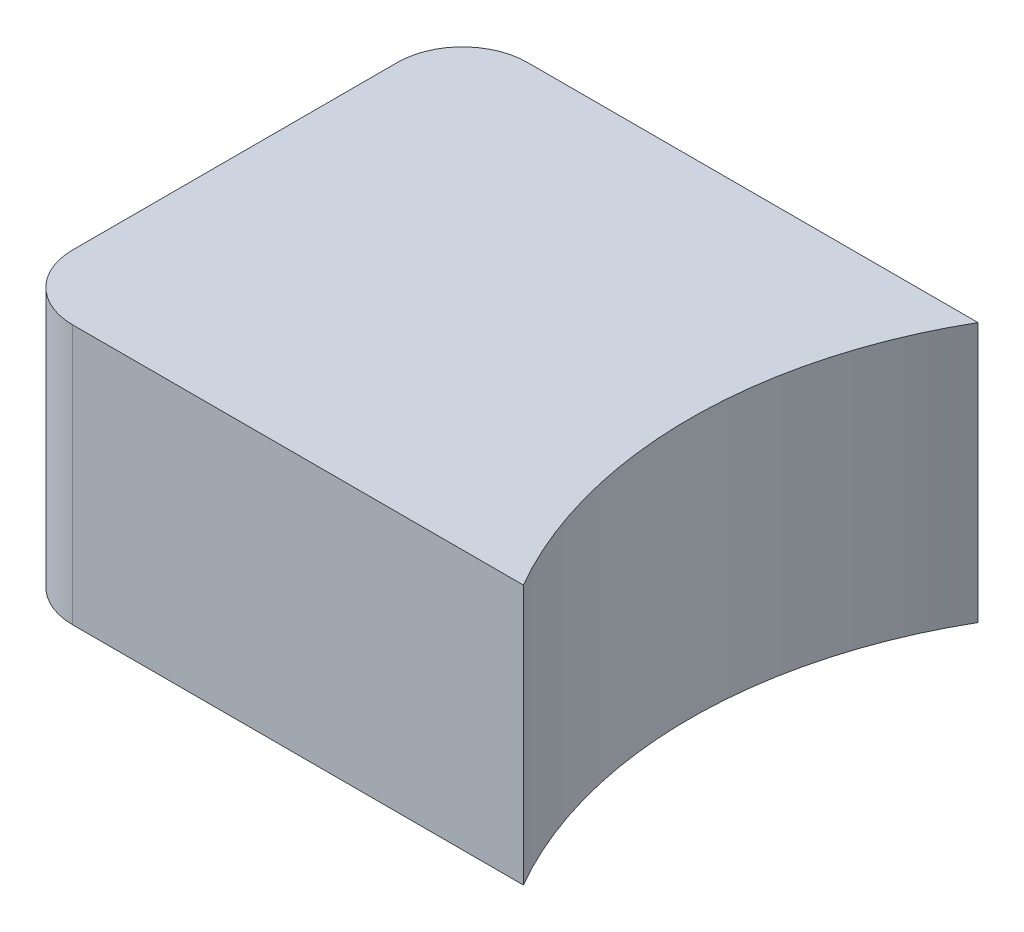
ISO-10303-21;
HEADER;
FILE_DESCRIPTION(('STEP AP214'),'2;1');
FILE_NAME('part.step','',(''),(''),'','','');
FILE_SCHEMA(('AUTOMOTIVE_DESIGN { 1 0 10303 214 1 1 1 1 }'));
ENDSEC;
DATA;
#1=APPLICATION_CONTEXT('core data for automotive mechanical design processes');
#2=APPLICATION_PROTOCOL_DEFINITION('international standard','automotive_design',2000,#1);
#3=PRODUCT_CONTEXT('',#1,'mechanical');
#4=PRODUCT('Part','Part','',(#3));
#5=PRODUCT_RELATED_PRODUCT_CATEGORY('part','',(#4));
#6=PRODUCT_DEFINITION_FORMATION('','',#4);
#7=PRODUCT_DEFINITION_CONTEXT('part definition',#1,'design');
#8=PRODUCT_DEFINITION('design','',#6,#7);
#9=PRODUCT_DEFINITION_SHAPE('','',#8);
#10=(LENGTH_UNIT() NAMED_UNIT(*) SI_UNIT(.MILLI.,.METRE.));
#11=(NAMED_UNIT(*) PLANE_ANGLE_UNIT() SI_UNIT($,.RADIAN.));
#12=(NAMED_UNIT(*) SI_UNIT($,.STERADIAN.) SOLID_ANGLE_UNIT());
#13=UNCERTAINTY_MEASURE_WITH_UNIT(LENGTH_MEASURE(1.E-05),#10,'distance_accuracy_value','');
#14=(GEOMETRIC_REPRESENTATION_CONTEXT(3) GLOBAL_UNCERTAINTY_ASSIGNED_CONTEXT((#13)) GLOBAL_UNIT_ASSIGNED_CONTEXT((#10,
#11,#12)) REPRESENTATION_CONTEXT('',''));
#15=CARTESIAN_POINT('',(0.,0.,0.));
#16=DIRECTION('',(0.,0.,1.));
#17=DIRECTION('',(1.,0.,0.));
#18=AXIS2_PLACEMENT_3D('',#15,#16,#17);
#19=CARTESIAN_POINT('',(0.,-6.,0.));
#20=DIRECTION('',(0.,-1.,0.));
#21=DIRECTION('',(0.,0.,-1.));
#22=AXIS2_PLACEMENT_3D('',#19,#20,#21);
#23=CYLINDRICAL_SURFACE('',#22,7.);
#24=CARTESIAN_POINT('',(0.,-10.,0.));
#25=DIRECTION('',(0.,-1.,0.));
#26=DIRECTION('',(0.,0.,1.));
#27=AXIS2_PLACEMENT_3D('',#24,#25,#26);
#28=CIRCLE('',#27,7.);
#29=CARTESIAN_POINT('',(-6.06217782649107,-10.,3.5));
#30=VERTEX_POINT('',#29);
#31=CARTESIAN_POINT('',(-6.06217782649107,-10.,-3.5));
#32=VERTEX_POINT('',#31);
#33=EDGE_CURVE('E117',#30,#32,#28,.T.);
#34=ORIENTED_EDGE('',*,*,#33,.T.);
#35=DIRECTION('',(0.,-1.,0.));
#36=VECTOR('',#35,1.);
#37=CARTESIAN_POINT('',(-6.06217782649107,-6.,-3.5));
#38=LINE('',#37,#36);
#39=CARTESIAN_POINT('',(-6.06217782649107,-6.,-3.5));
#40=VERTEX_POINT('',#39);
#41=EDGE_CURVE('E100',#40,#32,#38,.T.);
#42=ORIENTED_EDGE('',*,*,#41,.F.);
#43=CARTESIAN_POINT('',(0.,-6.,0.));
#44=DIRECTION('',(0.,-1.,0.));
#45=DIRECTION('',(0.,0.,1.));
#46=AXIS2_PLACEMENT_3D('',#43,#44,#45);
#47=CIRCLE('',#46,7.);
#48=CARTESIAN_POINT('',(-6.06217782649107,-6.,3.5));
#49=VERTEX_POINT('',#48);
#50=EDGE_CURVE('E105',#49,#40,#47,.T.);
#51=ORIENTED_EDGE('',*,*,#50,.F.);
#52=DIRECTION('',(0.,-1.,0.));
#53=VECTOR('',#52,1.);
#54=CARTESIAN_POINT('',(-6.06217782649107,-6.,3.5));
#55=LINE('',#54,#53);
#56=EDGE_CURVE('E119',#49,#30,#55,.T.);
#57=ORIENTED_EDGE('',*,*,#56,.T.);
#58=EDGE_LOOP('',(#34,#42,#51,#57));
#59=FACE_BOUND('',#58,.T.);
#60=ADVANCED_FACE('F41',(#59),#23,.F.);
#61=CARTESIAN_POINT('',(-14.,-6.,-3.5));
#62=DIRECTION('',(0.,0.,1.));
#63=DIRECTION('',(1.,0.,0.));
#64=AXIS2_PLACEMENT_3D('',#61,#62,#63);
#65=PLANE('',#64);
#66=DIRECTION('',(-1.,0.,0.));
#67=VECTOR('',#66,1.);
#68=CARTESIAN_POINT('',(-14.,-10.,-3.5));
#69=LINE('',#68,#67);
#70=CARTESIAN_POINT('',(-13.,-10.,-3.5));
#71=VERTEX_POINT('',#70);
#72=EDGE_CURVE('E180',#32,#71,#69,.T.);
#73=ORIENTED_EDGE('',*,*,#72,.T.);
#74=DIRECTION('',(0.,-1.,0.));
#75=VECTOR('',#74,1.);
#76=CARTESIAN_POINT('',(-13.,-6.,-3.5));
#77=LINE('',#76,#75);
#78=CARTESIAN_POINT('',(-13.,-6.,-3.5));
#79=VERTEX_POINT('',#78);
#80=EDGE_CURVE('E57',#71,#79,#77,.F.);
#81=ORIENTED_EDGE('',*,*,#80,.T.);
#82=DIRECTION('',(-1.,0.,0.));
#83=VECTOR('',#82,1.);
#84=CARTESIAN_POINT('',(-14.,-6.,-3.5));
#85=LINE('',#84,#83);
#86=EDGE_CURVE('E96',#40,#79,#85,.T.);
#87=ORIENTED_EDGE('',*,*,#86,.F.);
#88=ORIENTED_EDGE('',*,*,#41,.T.);
#89=EDGE_LOOP('',(#73,#81,#87,#88));
#90=FACE_BOUND('',#89,.T.);
#91=ADVANCED_FACE('F98',(#90),#65,.F.);
#92=CARTESIAN_POINT('',(-14.,-6.,3.5));
#93=DIRECTION('',(1.,0.,0.));
#94=DIRECTION('',(0.,0.,-1.));
#95=AXIS2_PLACEMENT_3D('',#92,#93,#94);
#96=PLANE('',#95);
#97=DIRECTION('',(0.,0.,1.));
#98=VECTOR('',#97,1.);
#99=CARTESIAN_POINT('',(-14.,-10.,3.5));
#100=LINE('',#99,#98);
#101=CARTESIAN_POINT('',(-14.,-10.,-2.5));
#102=VERTEX_POINT('',#101);
#103=CARTESIAN_POINT('',(-14.,-10.,2.5));
#104=VERTEX_POINT('',#103);
#105=EDGE_CURVE('E183',#102,#104,#100,.T.);
#106=ORIENTED_EDGE('',*,*,#105,.T.);
#107=DIRECTION('',(0.,-1.,0.));
#108=VECTOR('',#107,1.);
#109=CARTESIAN_POINT('',(-14.,-6.,2.5));
#110=LINE('',#109,#108);
#111=CARTESIAN_POINT('',(-14.,-6.,2.5));
#112=VERTEX_POINT('',#111);
#113=EDGE_CURVE('E65',#104,#112,#110,.F.);
#114=ORIENTED_EDGE('',*,*,#113,.T.);
#115=DIRECTION('',(0.,0.,1.));
#116=VECTOR('',#115,1.);
#117=CARTESIAN_POINT('',(-14.,-6.,3.5));
#118=LINE('',#117,#116);
#119=CARTESIAN_POINT('',(-14.,-6.,-2.5));
#120=VERTEX_POINT('',#119);
#121=EDGE_CURVE('E104',#120,#112,#118,.T.);
#122=ORIENTED_EDGE('',*,*,#121,.F.);
#123=DIRECTION('',(0.,-1.,0.));
#124=VECTOR('',#123,1.);
#125=CARTESIAN_POINT('',(-14.,-6.,-2.5));
#126=LINE('',#125,#124);
#127=EDGE_CURVE('E130',#120,#102,#126,.T.);
#128=ORIENTED_EDGE('',*,*,#127,.T.);
#129=EDGE_LOOP('',(#106,#114,#122,#128));
#130=FACE_BOUND('',#129,.T.);
#131=ADVANCED_FACE('F159',(#130),#96,.F.);
#132=CARTESIAN_POINT('',(-14.,-6.,3.5));
#133=DIRECTION('',(0.,0.,-1.));
#134=DIRECTION('',(-1.,0.,0.));
#135=AXIS2_PLACEMENT_3D('',#132,#133,#134);
#136=PLANE('',#135);
#137=DIRECTION('',(1.,0.,0.));
#138=VECTOR('',#137,1.);
#139=CARTESIAN_POINT('',(-14.,-6.,3.5));
#140=LINE('',#139,#138);
#141=CARTESIAN_POINT('',(-13.,-6.,3.5));
#142=VERTEX_POINT('',#141);
#143=EDGE_CURVE('E110',#142,#49,#140,.T.);
#144=ORIENTED_EDGE('',*,*,#143,.F.);
#145=DIRECTION('',(0.,-1.,0.));
#146=VECTOR('',#145,1.);
#147=CARTESIAN_POINT('',(-13.,-6.,3.5));
#148=LINE('',#147,#146);
#149=CARTESIAN_POINT('',(-13.,-10.,3.5));
#150=VERTEX_POINT('',#149);
#151=EDGE_CURVE('E118',#142,#150,#148,.T.);
#152=ORIENTED_EDGE('',*,*,#151,.T.);
#153=DIRECTION('',(1.,0.,0.));
#154=VECTOR('',#153,1.);
#155=CARTESIAN_POINT('',(-14.,-10.,3.5));
#156=LINE('',#155,#154);
#157=EDGE_CURVE('E114',#150,#30,#156,.T.);
#158=ORIENTED_EDGE('',*,*,#157,.T.);
#159=ORIENTED_EDGE('',*,*,#56,.F.);
#160=EDGE_LOOP('',(#144,#152,#158,#159));
#161=FACE_BOUND('',#160,.T.);
#162=ADVANCED_FACE('F186',(#161),#136,.F.);
#163=CARTESIAN_POINT('',(0.,-6.,0.));
#164=DIRECTION('',(0.,1.,0.));
#165=DIRECTION('',(0.,0.,1.));
#166=AXIS2_PLACEMENT_3D('',#163,#164,#165);
#167=PLANE('',#166);
#168=ORIENTED_EDGE('',*,*,#121,.T.);
#169=CARTESIAN_POINT('',(-13.,-6.,2.5));
#170=DIRECTION('',(0.,1.,0.));
#171=DIRECTION('',(0.,0.,1.));
#172=AXIS2_PLACEMENT_3D('',#169,#170,#171);
#173=CIRCLE('',#172,1.);
#174=EDGE_CURVE('E136',#112,#142,#173,.T.);
#175=ORIENTED_EDGE('',*,*,#174,.T.);
#176=ORIENTED_EDGE('',*,*,#143,.T.);
#177=ORIENTED_EDGE('',*,*,#50,.T.);
#178=ORIENTED_EDGE('',*,*,#86,.T.);
#179=CARTESIAN_POINT('',(-13.,-6.,-2.5));
#180=DIRECTION('',(0.,1.,0.));
#181=DIRECTION('',(0.,0.,1.));
#182=AXIS2_PLACEMENT_3D('',#179,#180,#181);
#183=CIRCLE('',#182,1.);
#184=EDGE_CURVE('E134',#79,#120,#183,.T.);
#185=ORIENTED_EDGE('',*,*,#184,.T.);
#186=EDGE_LOOP('',(#168,#175,#176,#177,#178,#185));
#187=FACE_BOUND('',#186,.T.);
#188=ADVANCED_FACE('F108',(#187),#167,.T.);
#189=CARTESIAN_POINT('',(0.,-10.,0.));
#190=DIRECTION('',(0.,1.,0.));
#191=DIRECTION('',(0.,0.,1.));
#192=AXIS2_PLACEMENT_3D('',#189,#190,#191);
#193=PLANE('',#192);
#194=CARTESIAN_POINT('',(-10.5,-10.,0.));
#195=DIRECTION('',(0.,1.,0.));
#196=DIRECTION('',(0.,0.,1.));
#197=AXIS2_PLACEMENT_3D('',#194,#195,#196);
#198=CIRCLE('',#197,3.3);
#199=CARTESIAN_POINT('',(-10.5,-10.,3.3));
#200=VERTEX_POINT('',#199);
#201=EDGE_CURVE('E11',#200,#200,#198,.T.);
#202=ORIENTED_EDGE('',*,*,#201,.T.);
#203=EDGE_LOOP('',(#202));
#204=FACE_BOUND('',#203,.T.);
#205=ORIENTED_EDGE('',*,*,#157,.F.);
#206=CARTESIAN_POINT('',(-13.,-10.,2.5));
#207=DIRECTION('',(0.,1.,0.));
#208=DIRECTION('',(0.,0.,1.));
#209=AXIS2_PLACEMENT_3D('',#206,#207,#208);
#210=CIRCLE('',#209,1.);
#211=EDGE_CURVE('E128',#150,#104,#210,.F.);
#212=ORIENTED_EDGE('',*,*,#211,.T.);
#213=ORIENTED_EDGE('',*,*,#105,.F.);
#214=CARTESIAN_POINT('',(-13.,-10.,-2.5));
#215=DIRECTION('',(0.,1.,0.));
#216=DIRECTION('',(0.,0.,1.));
#217=AXIS2_PLACEMENT_3D('',#214,#215,#216);
#218=CIRCLE('',#217,1.);
#219=EDGE_CURVE('E122',#102,#71,#218,.F.);
#220=ORIENTED_EDGE('',*,*,#219,.T.);
#221=ORIENTED_EDGE('',*,*,#72,.F.);
#222=ORIENTED_EDGE('',*,*,#33,.F.);
#223=EDGE_LOOP('',(#205,#212,#213,#220,#221,#222));
#224=FACE_BOUND('',#223,.T.);
#225=ADVANCED_FACE('F166',(#204,#224),#193,.F.);
#226=CARTESIAN_POINT('',(-13.,-6.,2.5));
#227=DIRECTION('',(0.,-1.,0.));
#228=DIRECTION('',(0.,0.,-1.));
#229=AXIS2_PLACEMENT_3D('',#226,#227,#228);
#230=CYLINDRICAL_SURFACE('',#229,1.);
#231=ORIENTED_EDGE('',*,*,#174,.F.);
#232=ORIENTED_EDGE('',*,*,#113,.F.);
#233=ORIENTED_EDGE('',*,*,#211,.F.);
#234=ORIENTED_EDGE('',*,*,#151,.F.);
#235=EDGE_LOOP('',(#231,#232,#233,#234));
#236=FACE_BOUND('',#235,.T.);
#237=ADVANCED_FACE('F163',(#236),#230,.T.);
#238=CARTESIAN_POINT('',(-13.,-6.,-2.5));
#239=DIRECTION('',(0.,-1.,0.));
#240=DIRECTION('',(0.,0.,-1.));
#241=AXIS2_PLACEMENT_3D('',#238,#239,#240);
#242=CYLINDRICAL_SURFACE('',#241,1.);
#243=ORIENTED_EDGE('',*,*,#184,.F.);
#244=ORIENTED_EDGE('',*,*,#80,.F.);
#245=ORIENTED_EDGE('',*,*,#219,.F.);
#246=ORIENTED_EDGE('',*,*,#127,.F.);
#247=EDGE_LOOP('',(#243,#244,#245,#246));
#248=FACE_BOUND('',#247,.T.);
#249=ADVANCED_FACE('F165',(#248),#242,.T.);
#250=CARTESIAN_POINT('',(-10.5,-8.5,0.));
#251=DIRECTION('',(0.,-1.,0.));
#252=DIRECTION('',(0.,0.,-1.));
#253=AXIS2_PLACEMENT_3D('',#250,#251,#252);
#254=CYLINDRICAL_SURFACE('',#253,3.);
#255=CARTESIAN_POINT('',(-10.5,-9.7,0.));
#256=DIRECTION('',(0.,1.,0.));
#257=DIRECTION('',(0.,0.,1.));
#258=AXIS2_PLACEMENT_3D('',#255,#256,#257);
#259=CIRCLE('',#258,3.);
#260=CARTESIAN_POINT('',(-10.5,-9.7,3.));
#261=VERTEX_POINT('',#260);
#262=EDGE_CURVE('E50',#261,#261,#259,.F.);
#263=ORIENTED_EDGE('',*,*,#262,.T.);
#264=EDGE_LOOP('',(#263));
#265=FACE_BOUND('',#264,.T.);
#266=CARTESIAN_POINT('',(-10.5,-8.5,0.));
#267=DIRECTION('',(0.,-1.,0.));
#268=DIRECTION('',(0.,0.,-1.));
#269=AXIS2_PLACEMENT_3D('',#266,#267,#268);
#270=CIRCLE('',#269,3.);
#271=CARTESIAN_POINT('',(-10.5,-8.5,-3.));
#272=VERTEX_POINT('',#271);
#273=EDGE_CURVE('E181',#272,#272,#270,.T.);
#274=ORIENTED_EDGE('',*,*,#273,.F.);
#275=EDGE_LOOP('',(#274));
#276=FACE_BOUND('',#275,.T.);
#277=ADVANCED_FACE('F141',(#265,#276),#254,.F.);
#278=CARTESIAN_POINT('',(-10.5,-8.5,0.));
#279=DIRECTION('',(0.,-1.,0.));
#280=DIRECTION('',(0.,0.,-1.));
#281=AXIS2_PLACEMENT_3D('',#278,#279,#280);
#282=PLANE('',#281);
#283=ORIENTED_EDGE('',*,*,#273,.T.);
#284=EDGE_LOOP('',(#283));
#285=FACE_BOUND('',#284,.T.);
#286=ADVANCED_FACE('F145',(#285),#282,.T.);
#287=CARTESIAN_POINT('',(-10.5,-9.7,0.));
#288=DIRECTION('',(0.,-1.,0.));
#289=DIRECTION('',(0.,0.,-1.));
#290=AXIS2_PLACEMENT_3D('',#287,#288,#289);
#291=CONICAL_SURFACE('',#290,3.,0.785398163397455);
#292=ORIENTED_EDGE('',*,*,#201,.F.);
#293=EDGE_LOOP('',(#292));
#294=FACE_BOUND('',#293,.T.);
#295=ORIENTED_EDGE('',*,*,#262,.F.);
#296=EDGE_LOOP('',(#295));
#297=FACE_BOUND('',#296,.T.);
#298=ADVANCED_FACE('F44',(#294,#297),#291,.F.);
#299=CLOSED_SHELL('',(#60,#91,#131,#162,#188,#225,#237,#249,#277,#286,#298));
#300=MANIFOLD_SOLID_BREP('B2',#299);
#301=ADVANCED_BREP_SHAPE_REPRESENTATION('',(#18,#300),#14);
#302=SHAPE_DEFINITION_REPRESENTATION(#9,#301);
ENDSEC;
END-ISO-10303-21;
